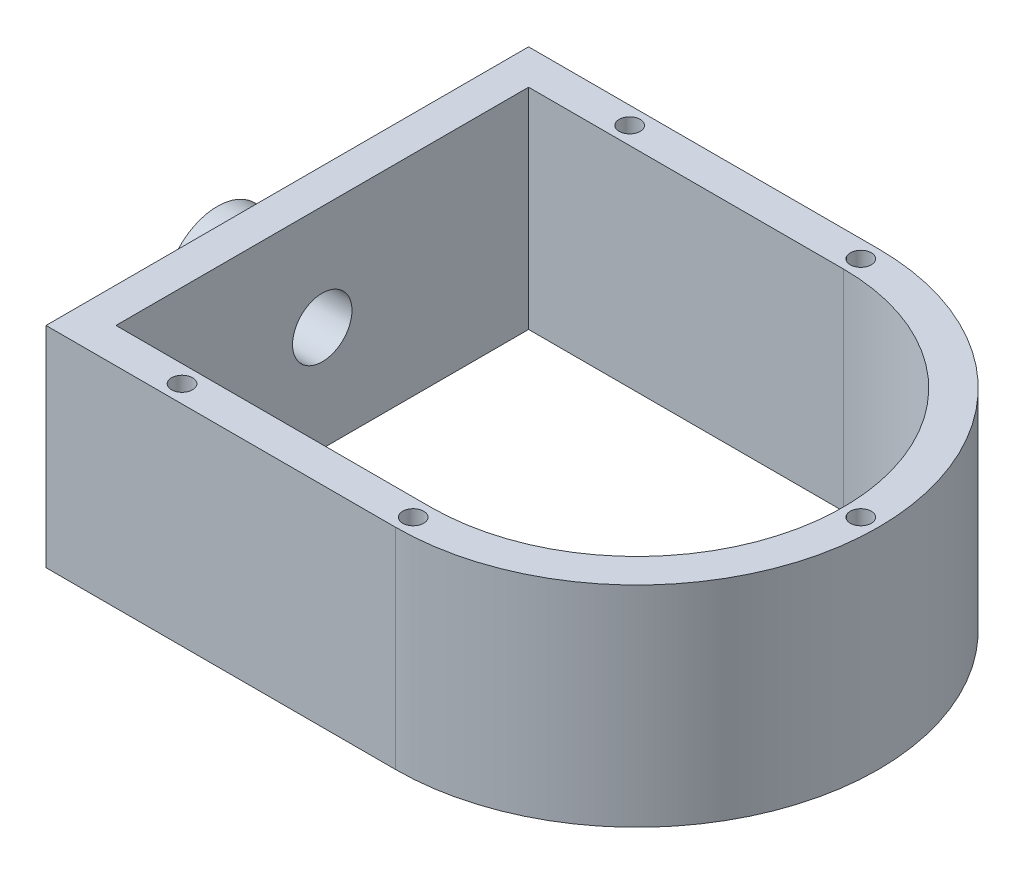
ISO-10303-21;
HEADER;
FILE_DESCRIPTION(('STEP AP214'),'2;1');
FILE_NAME('part.step','',(''),(''),'','','');
FILE_SCHEMA(('AUTOMOTIVE_DESIGN { 1 0 10303 214 1 1 1 1 }'));
ENDSEC;
DATA;
#1=APPLICATION_CONTEXT('core data for automotive mechanical design processes');
#2=APPLICATION_PROTOCOL_DEFINITION('international standard','automotive_design',2000,#1);
#3=PRODUCT_CONTEXT('',#1,'mechanical');
#4=PRODUCT('Part','Part','',(#3));
#5=PRODUCT_RELATED_PRODUCT_CATEGORY('part','',(#4));
#6=PRODUCT_DEFINITION_FORMATION('','',#4);
#7=PRODUCT_DEFINITION_CONTEXT('part definition',#1,'design');
#8=PRODUCT_DEFINITION('design','',#6,#7);
#9=PRODUCT_DEFINITION_SHAPE('','',#8);
#10=(LENGTH_UNIT() NAMED_UNIT(*) SI_UNIT(.MILLI.,.METRE.));
#11=(NAMED_UNIT(*) PLANE_ANGLE_UNIT() SI_UNIT($,.RADIAN.));
#12=(NAMED_UNIT(*) SI_UNIT($,.STERADIAN.) SOLID_ANGLE_UNIT());
#13=UNCERTAINTY_MEASURE_WITH_UNIT(LENGTH_MEASURE(1.E-05),#10,'distance_accuracy_value','');
#14=(GEOMETRIC_REPRESENTATION_CONTEXT(3) GLOBAL_UNCERTAINTY_ASSIGNED_CONTEXT((#13)) GLOBAL_UNIT_ASSIGNED_CONTEXT((#10,
#11,#12)) REPRESENTATION_CONTEXT('',''));
#15=CARTESIAN_POINT('',(0.,0.,0.));
#16=DIRECTION('',(0.,0.,1.));
#17=DIRECTION('',(1.,0.,0.));
#18=AXIS2_PLACEMENT_3D('',#15,#16,#17);
#19=CARTESIAN_POINT('',(-40.,30.,0.));
#20=DIRECTION('',(-1.,0.,0.));
#21=DIRECTION('',(0.,0.,1.));
#22=AXIS2_PLACEMENT_3D('',#19,#20,#21);
#23=PLANE('',#22);
#24=CARTESIAN_POINT('',(-40.,15.,0.));
#25=DIRECTION('',(-1.,0.,0.));
#26=DIRECTION('',(0.,0.,1.));
#27=AXIS2_PLACEMENT_3D('',#24,#25,#26);
#28=CIRCLE('',#27,12.5);
#29=CARTESIAN_POINT('',(-40.,15.,12.5));
#30=VERTEX_POINT('',#29);
#31=EDGE_CURVE('E11',#30,#30,#28,.F.);
#32=ORIENTED_EDGE('',*,*,#31,.T.);
#33=EDGE_LOOP('',(#32));
#34=FACE_BOUND('',#33,.T.);
#35=DIRECTION('',(0.,0.,-1.));
#36=VECTOR('',#35,1.);
#37=CARTESIAN_POINT('',(-40.,0.,0.));
#38=LINE('',#37,#36);
#39=CARTESIAN_POINT('',(-40.,0.,34.5));
#40=VERTEX_POINT('',#39);
#41=CARTESIAN_POINT('',(-40.,0.,-34.5));
#42=VERTEX_POINT('',#41);
#43=EDGE_CURVE('E203',#40,#42,#38,.T.);
#44=ORIENTED_EDGE('',*,*,#43,.F.);
#45=DIRECTION('',(0.,-1.,0.));
#46=VECTOR('',#45,1.);
#47=CARTESIAN_POINT('',(-40.,30.,34.5));
#48=LINE('',#47,#46);
#49=CARTESIAN_POINT('',(-40.,30.,34.5));
#50=VERTEX_POINT('',#49);
#51=EDGE_CURVE('E226',#50,#40,#48,.T.);
#52=ORIENTED_EDGE('',*,*,#51,.F.);
#53=DIRECTION('',(0.,0.,-1.));
#54=VECTOR('',#53,1.);
#55=CARTESIAN_POINT('',(-40.,30.,0.));
#56=LINE('',#55,#54);
#57=CARTESIAN_POINT('',(-40.,30.,-34.5));
#58=VERTEX_POINT('',#57);
#59=EDGE_CURVE('E167',#50,#58,#56,.T.);
#60=ORIENTED_EDGE('',*,*,#59,.T.);
#61=DIRECTION('',(0.,-1.,0.));
#62=VECTOR('',#61,1.);
#63=CARTESIAN_POINT('',(-40.,30.,-34.5));
#64=LINE('',#63,#62);
#65=EDGE_CURVE('E228',#58,#42,#64,.T.);
#66=ORIENTED_EDGE('',*,*,#65,.T.);
#67=EDGE_LOOP('',(#44,#52,#60,#66));
#68=FACE_BOUND('',#67,.T.);
#69=ADVANCED_FACE('F35',(#34,#68),#23,.T.);
#70=CARTESIAN_POINT('',(10.,30.,0.));
#71=DIRECTION('',(0.,-1.,0.));
#72=DIRECTION('',(0.,0.,-1.));
#73=AXIS2_PLACEMENT_3D('',#70,#71,#72);
#74=CYLINDRICAL_SURFACE('',#73,29.5);
#75=DIRECTION('',(0.,-1.,0.));
#76=VECTOR('',#75,1.);
#77=CARTESIAN_POINT('',(30.,3.,21.6852484422014));
#78=LINE('',#77,#76);
#79=CARTESIAN_POINT('',(30.,3.,21.6852484422014));
#80=VERTEX_POINT('',#79);
#81=CARTESIAN_POINT('',(30.,0.,21.6852484422014));
#82=VERTEX_POINT('',#81);
#83=EDGE_CURVE('E127',#80,#82,#78,.T.);
#84=ORIENTED_EDGE('',*,*,#83,.T.);
#85=CARTESIAN_POINT('',(10.,0.,0.));
#86=DIRECTION('',(0.,1.,0.));
#87=DIRECTION('',(0.,0.,1.));
#88=AXIS2_PLACEMENT_3D('',#85,#86,#87);
#89=CIRCLE('',#88,29.5);
#90=CARTESIAN_POINT('',(10.,0.,29.5));
#91=VERTEX_POINT('',#90);
#92=EDGE_CURVE('E113',#82,#91,#89,.F.);
#93=ORIENTED_EDGE('',*,*,#92,.T.);
#94=DIRECTION('',(0.,-1.,0.));
#95=VECTOR('',#94,1.);
#96=CARTESIAN_POINT('',(10.,30.,29.5));
#97=LINE('',#96,#95);
#98=CARTESIAN_POINT('',(10.,30.,29.5));
#99=VERTEX_POINT('',#98);
#100=EDGE_CURVE('E220',#99,#91,#97,.T.);
#101=ORIENTED_EDGE('',*,*,#100,.F.);
#102=CARTESIAN_POINT('',(10.,30.,0.));
#103=DIRECTION('',(0.,1.,0.));
#104=DIRECTION('',(0.,0.,1.));
#105=AXIS2_PLACEMENT_3D('',#102,#103,#104);
#106=CIRCLE('',#105,29.5);
#107=CARTESIAN_POINT('',(10.,30.,-29.5));
#108=VERTEX_POINT('',#107);
#109=EDGE_CURVE('E176',#108,#99,#106,.F.);
#110=ORIENTED_EDGE('',*,*,#109,.F.);
#111=DIRECTION('',(0.,-1.,0.));
#112=VECTOR('',#111,1.);
#113=CARTESIAN_POINT('',(10.,30.,-29.5));
#114=LINE('',#113,#112);
#115=CARTESIAN_POINT('',(10.,0.,-29.5));
#116=VERTEX_POINT('',#115);
#117=EDGE_CURVE('E222',#108,#116,#114,.T.);
#118=ORIENTED_EDGE('',*,*,#117,.T.);
#119=CARTESIAN_POINT('',(30.,0.,-21.6852484422014));
#120=VERTEX_POINT('',#119);
#121=EDGE_CURVE('E123',#116,#120,#89,.F.);
#122=ORIENTED_EDGE('',*,*,#121,.T.);
#123=DIRECTION('',(0.,-1.,0.));
#124=VECTOR('',#123,1.);
#125=CARTESIAN_POINT('',(30.,3.,-21.6852484422014));
#126=LINE('',#125,#124);
#127=CARTESIAN_POINT('',(30.,3.,-21.6852484422014));
#128=VERTEX_POINT('',#127);
#129=EDGE_CURVE('E56',#128,#120,#126,.T.);
#130=ORIENTED_EDGE('',*,*,#129,.F.);
#131=CARTESIAN_POINT('',(10.,3.,0.));
#132=DIRECTION('',(0.,1.,0.));
#133=DIRECTION('',(0.,0.,1.));
#134=AXIS2_PLACEMENT_3D('',#131,#132,#133);
#135=CIRCLE('',#134,29.5);
#136=EDGE_CURVE('E51',#128,#80,#135,.F.);
#137=ORIENTED_EDGE('',*,*,#136,.T.);
#138=EDGE_LOOP('',(#84,#93,#101,#110,#118,#122,#130,#137));
#139=FACE_BOUND('',#138,.T.);
#140=ADVANCED_FACE('F128',(#139),#74,.F.);
#141=CARTESIAN_POINT('',(0.,30.,-29.5));
#142=DIRECTION('',(0.,0.,-1.));
#143=DIRECTION('',(-1.,0.,0.));
#144=AXIS2_PLACEMENT_3D('',#141,#142,#143);
#145=PLANE('',#144);
#146=DIRECTION('',(1.,0.,0.));
#147=VECTOR('',#146,1.);
#148=CARTESIAN_POINT('',(0.,0.,-29.5));
#149=LINE('',#148,#147);
#150=CARTESIAN_POINT('',(-35.,0.,-29.5));
#151=VERTEX_POINT('',#150);
#152=EDGE_CURVE('E124',#151,#116,#149,.T.);
#153=ORIENTED_EDGE('',*,*,#152,.T.);
#154=ORIENTED_EDGE('',*,*,#117,.F.);
#155=DIRECTION('',(1.,0.,0.));
#156=VECTOR('',#155,1.);
#157=CARTESIAN_POINT('',(0.,30.,-29.5));
#158=LINE('',#157,#156);
#159=CARTESIAN_POINT('',(-35.,30.,-29.5));
#160=VERTEX_POINT('',#159);
#161=EDGE_CURVE('E173',#160,#108,#158,.T.);
#162=ORIENTED_EDGE('',*,*,#161,.F.);
#163=DIRECTION('',(0.,-1.,0.));
#164=VECTOR('',#163,1.);
#165=CARTESIAN_POINT('',(-35.,30.,-29.5));
#166=LINE('',#165,#164);
#167=EDGE_CURVE('E213',#160,#151,#166,.T.);
#168=ORIENTED_EDGE('',*,*,#167,.T.);
#169=EDGE_LOOP('',(#153,#154,#162,#168));
#170=FACE_BOUND('',#169,.T.);
#171=ADVANCED_FACE('F253',(#170),#145,.F.);
#172=CARTESIAN_POINT('',(0.,30.,29.5));
#173=DIRECTION('',(0.,0.,1.));
#174=DIRECTION('',(1.,0.,0.));
#175=AXIS2_PLACEMENT_3D('',#172,#173,#174);
#176=PLANE('',#175);
#177=DIRECTION('',(-1.,0.,0.));
#178=VECTOR('',#177,1.);
#179=CARTESIAN_POINT('',(0.,0.,29.5));
#180=LINE('',#179,#178);
#181=CARTESIAN_POINT('',(-35.,0.,29.5));
#182=VERTEX_POINT('',#181);
#183=EDGE_CURVE('E120',#91,#182,#180,.T.);
#184=ORIENTED_EDGE('',*,*,#183,.T.);
#185=DIRECTION('',(0.,-1.,0.));
#186=VECTOR('',#185,1.);
#187=CARTESIAN_POINT('',(-35.,30.,29.5));
#188=LINE('',#187,#186);
#189=CARTESIAN_POINT('',(-35.,30.,29.5));
#190=VERTEX_POINT('',#189);
#191=EDGE_CURVE('E216',#190,#182,#188,.T.);
#192=ORIENTED_EDGE('',*,*,#191,.F.);
#193=DIRECTION('',(-1.,0.,0.));
#194=VECTOR('',#193,1.);
#195=CARTESIAN_POINT('',(0.,30.,29.5));
#196=LINE('',#195,#194);
#197=EDGE_CURVE('E178',#99,#190,#196,.T.);
#198=ORIENTED_EDGE('',*,*,#197,.F.);
#199=ORIENTED_EDGE('',*,*,#100,.T.);
#200=EDGE_LOOP('',(#184,#192,#198,#199));
#201=FACE_BOUND('',#200,.T.);
#202=ADVANCED_FACE('F267',(#201),#176,.F.);
#203=CARTESIAN_POINT('',(10.,30.,0.));
#204=DIRECTION('',(0.,-1.,0.));
#205=DIRECTION('',(0.,0.,-1.));
#206=AXIS2_PLACEMENT_3D('',#203,#204,#205);
#207=CYLINDRICAL_SURFACE('',#206,34.5);
#208=CARTESIAN_POINT('',(10.,0.,0.));
#209=DIRECTION('',(0.,1.,0.));
#210=DIRECTION('',(0.,0.,1.));
#211=AXIS2_PLACEMENT_3D('',#208,#209,#210);
#212=CIRCLE('',#211,34.5);
#213=CARTESIAN_POINT('',(10.,0.,-34.5));
#214=VERTEX_POINT('',#213);
#215=CARTESIAN_POINT('',(9.99999999999999,0.,34.5));
#216=VERTEX_POINT('',#215);
#217=EDGE_CURVE('E197',#214,#216,#212,.F.);
#218=ORIENTED_EDGE('',*,*,#217,.F.);
#219=DIRECTION('',(0.,-1.,0.));
#220=VECTOR('',#219,1.);
#221=CARTESIAN_POINT('',(10.,30.,-34.5));
#222=LINE('',#221,#220);
#223=CARTESIAN_POINT('',(10.,30.,-34.5));
#224=VERTEX_POINT('',#223);
#225=EDGE_CURVE('E217',#224,#214,#222,.T.);
#226=ORIENTED_EDGE('',*,*,#225,.F.);
#227=CARTESIAN_POINT('',(10.,30.,0.));
#228=DIRECTION('',(0.,1.,0.));
#229=DIRECTION('',(0.,0.,1.));
#230=AXIS2_PLACEMENT_3D('',#227,#228,#229);
#231=CIRCLE('',#230,34.5);
#232=CARTESIAN_POINT('',(9.99999999999999,30.,34.5));
#233=VERTEX_POINT('',#232);
#234=EDGE_CURVE('E161',#224,#233,#231,.F.);
#235=ORIENTED_EDGE('',*,*,#234,.T.);
#236=DIRECTION('',(0.,-1.,0.));
#237=VECTOR('',#236,1.);
#238=CARTESIAN_POINT('',(9.99999999999999,30.,34.5));
#239=LINE('',#238,#237);
#240=EDGE_CURVE('E182',#233,#216,#239,.T.);
#241=ORIENTED_EDGE('',*,*,#240,.T.);
#242=EDGE_LOOP('',(#218,#226,#235,#241));
#243=FACE_BOUND('',#242,.T.);
#244=ADVANCED_FACE('F263',(#243),#207,.T.);
#245=CARTESIAN_POINT('',(0.,30.,-34.5));
#246=DIRECTION('',(0.,0.,-1.));
#247=DIRECTION('',(-1.,0.,0.));
#248=AXIS2_PLACEMENT_3D('',#245,#246,#247);
#249=PLANE('',#248);
#250=DIRECTION('',(1.,0.,0.));
#251=VECTOR('',#250,1.);
#252=CARTESIAN_POINT('',(0.,0.,-34.5));
#253=LINE('',#252,#251);
#254=EDGE_CURVE('E200',#42,#214,#253,.T.);
#255=ORIENTED_EDGE('',*,*,#254,.F.);
#256=ORIENTED_EDGE('',*,*,#65,.F.);
#257=DIRECTION('',(1.,0.,0.));
#258=VECTOR('',#257,1.);
#259=CARTESIAN_POINT('',(0.,30.,-34.5));
#260=LINE('',#259,#258);
#261=EDGE_CURVE('E164',#58,#224,#260,.T.);
#262=ORIENTED_EDGE('',*,*,#261,.T.);
#263=ORIENTED_EDGE('',*,*,#225,.T.);
#264=EDGE_LOOP('',(#255,#256,#262,#263));
#265=FACE_BOUND('',#264,.T.);
#266=ADVANCED_FACE('F260',(#265),#249,.T.);
#267=CARTESIAN_POINT('',(0.,30.,34.5));
#268=DIRECTION('',(0.,0.,1.));
#269=DIRECTION('',(1.,0.,0.));
#270=AXIS2_PLACEMENT_3D('',#267,#268,#269);
#271=PLANE('',#270);
#272=DIRECTION('',(-1.,0.,0.));
#273=VECTOR('',#272,1.);
#274=CARTESIAN_POINT('',(0.,0.,34.5));
#275=LINE('',#274,#273);
#276=EDGE_CURVE('E206',#216,#40,#275,.T.);
#277=ORIENTED_EDGE('',*,*,#276,.F.);
#278=ORIENTED_EDGE('',*,*,#240,.F.);
#279=DIRECTION('',(-1.,0.,0.));
#280=VECTOR('',#279,1.);
#281=CARTESIAN_POINT('',(0.,30.,34.5));
#282=LINE('',#281,#280);
#283=EDGE_CURVE('E170',#233,#50,#282,.T.);
#284=ORIENTED_EDGE('',*,*,#283,.T.);
#285=ORIENTED_EDGE('',*,*,#51,.T.);
#286=EDGE_LOOP('',(#277,#278,#284,#285));
#287=FACE_BOUND('',#286,.T.);
#288=ADVANCED_FACE('F258',(#287),#271,.T.);
#289=CARTESIAN_POINT('',(-23.050007367458,30.,-32.));
#290=DIRECTION('',(0.,-1.,0.));
#291=DIRECTION('',(0.,0.,-1.));
#292=AXIS2_PLACEMENT_3D('',#289,#290,#291);
#293=CYLINDRICAL_SURFACE('',#292,1.5);
#294=CARTESIAN_POINT('',(-23.050007367458,30.,-32.));
#295=DIRECTION('',(0.,1.,0.));
#296=DIRECTION('',(0.,0.,1.));
#297=AXIS2_PLACEMENT_3D('',#294,#295,#296);
#298=CIRCLE('',#297,1.5);
#299=CARTESIAN_POINT('',(-23.050007367458,30.,-30.5));
#300=VERTEX_POINT('',#299);
#301=EDGE_CURVE('E158',#300,#300,#298,.T.);
#302=ORIENTED_EDGE('',*,*,#301,.T.);
#303=EDGE_LOOP('',(#302));
#304=FACE_BOUND('',#303,.T.);
#305=CARTESIAN_POINT('',(-23.050007367458,0.,-32.));
#306=DIRECTION('',(0.,1.,0.));
#307=DIRECTION('',(0.,0.,1.));
#308=AXIS2_PLACEMENT_3D('',#305,#306,#307);
#309=CIRCLE('',#308,1.5);
#310=CARTESIAN_POINT('',(-23.050007367458,0.,-30.5));
#311=VERTEX_POINT('',#310);
#312=EDGE_CURVE('E194',#311,#311,#309,.T.);
#313=ORIENTED_EDGE('',*,*,#312,.F.);
#314=EDGE_LOOP('',(#313));
#315=FACE_BOUND('',#314,.T.);
#316=ADVANCED_FACE('F269',(#304,#315),#293,.F.);
#317=CARTESIAN_POINT('',(-23.050007367458,30.,32.));
#318=DIRECTION('',(0.,-1.,0.));
#319=DIRECTION('',(0.,0.,-1.));
#320=AXIS2_PLACEMENT_3D('',#317,#318,#319);
#321=CYLINDRICAL_SURFACE('',#320,1.5);
#322=CARTESIAN_POINT('',(-23.050007367458,30.,32.));
#323=DIRECTION('',(0.,1.,0.));
#324=DIRECTION('',(0.,0.,1.));
#325=AXIS2_PLACEMENT_3D('',#322,#323,#324);
#326=CIRCLE('',#325,1.5);
#327=CARTESIAN_POINT('',(-23.050007367458,30.,33.5));
#328=VERTEX_POINT('',#327);
#329=EDGE_CURVE('E155',#328,#328,#326,.T.);
#330=ORIENTED_EDGE('',*,*,#329,.T.);
#331=EDGE_LOOP('',(#330));
#332=FACE_BOUND('',#331,.T.);
#333=CARTESIAN_POINT('',(-23.050007367458,0.,32.));
#334=DIRECTION('',(0.,1.,0.));
#335=DIRECTION('',(0.,0.,1.));
#336=AXIS2_PLACEMENT_3D('',#333,#334,#335);
#337=CIRCLE('',#336,1.5);
#338=CARTESIAN_POINT('',(-23.050007367458,0.,33.5));
#339=VERTEX_POINT('',#338);
#340=EDGE_CURVE('E191',#339,#339,#337,.T.);
#341=ORIENTED_EDGE('',*,*,#340,.F.);
#342=EDGE_LOOP('',(#341));
#343=FACE_BOUND('',#342,.T.);
#344=ADVANCED_FACE('F272',(#332,#343),#321,.F.);
#345=CARTESIAN_POINT('',(10.,30.,-32.));
#346=DIRECTION('',(0.,-1.,0.));
#347=DIRECTION('',(0.,0.,-1.));
#348=AXIS2_PLACEMENT_3D('',#345,#346,#347);
#349=CYLINDRICAL_SURFACE('',#348,1.5);
#350=CARTESIAN_POINT('',(10.,30.,-32.));
#351=DIRECTION('',(0.,1.,0.));
#352=DIRECTION('',(0.,0.,1.));
#353=AXIS2_PLACEMENT_3D('',#350,#351,#352);
#354=CIRCLE('',#353,1.5);
#355=CARTESIAN_POINT('',(10.,30.,-30.5));
#356=VERTEX_POINT('',#355);
#357=EDGE_CURVE('E152',#356,#356,#354,.T.);
#358=ORIENTED_EDGE('',*,*,#357,.T.);
#359=EDGE_LOOP('',(#358));
#360=FACE_BOUND('',#359,.T.);
#361=CARTESIAN_POINT('',(10.,0.,-32.));
#362=DIRECTION('',(0.,1.,0.));
#363=DIRECTION('',(0.,0.,1.));
#364=AXIS2_PLACEMENT_3D('',#361,#362,#363);
#365=CIRCLE('',#364,1.5);
#366=CARTESIAN_POINT('',(10.,0.,-30.5));
#367=VERTEX_POINT('',#366);
#368=EDGE_CURVE('E188',#367,#367,#365,.T.);
#369=ORIENTED_EDGE('',*,*,#368,.F.);
#370=EDGE_LOOP('',(#369));
#371=FACE_BOUND('',#370,.T.);
#372=ADVANCED_FACE('F276',(#360,#371),#349,.F.);
#373=CARTESIAN_POINT('',(10.,30.,32.));
#374=DIRECTION('',(0.,-1.,0.));
#375=DIRECTION('',(0.,0.,-1.));
#376=AXIS2_PLACEMENT_3D('',#373,#374,#375);
#377=CYLINDRICAL_SURFACE('',#376,1.5);
#378=CARTESIAN_POINT('',(10.,30.,32.));
#379=DIRECTION('',(0.,1.,0.));
#380=DIRECTION('',(0.,0.,1.));
#381=AXIS2_PLACEMENT_3D('',#378,#379,#380);
#382=CIRCLE('',#381,1.5);
#383=CARTESIAN_POINT('',(10.,30.,33.5));
#384=VERTEX_POINT('',#383);
#385=EDGE_CURVE('E148',#384,#384,#382,.T.);
#386=ORIENTED_EDGE('',*,*,#385,.T.);
#387=EDGE_LOOP('',(#386));
#388=FACE_BOUND('',#387,.T.);
#389=CARTESIAN_POINT('',(10.,0.,32.));
#390=DIRECTION('',(0.,1.,0.));
#391=DIRECTION('',(0.,0.,1.));
#392=AXIS2_PLACEMENT_3D('',#389,#390,#391);
#393=CIRCLE('',#392,1.5);
#394=CARTESIAN_POINT('',(10.,0.,33.5));
#395=VERTEX_POINT('',#394);
#396=EDGE_CURVE('E185',#395,#395,#393,.T.);
#397=ORIENTED_EDGE('',*,*,#396,.F.);
#398=EDGE_LOOP('',(#397));
#399=FACE_BOUND('',#398,.T.);
#400=ADVANCED_FACE('F280',(#388,#399),#377,.F.);
#401=CARTESIAN_POINT('',(42.,30.,0.));
#402=DIRECTION('',(0.,-1.,0.));
#403=DIRECTION('',(0.,0.,-1.));
#404=AXIS2_PLACEMENT_3D('',#401,#402,#403);
#405=CYLINDRICAL_SURFACE('',#404,1.5);
#406=CARTESIAN_POINT('',(42.,30.,0.));
#407=DIRECTION('',(0.,1.,0.));
#408=DIRECTION('',(0.,0.,1.));
#409=AXIS2_PLACEMENT_3D('',#406,#407,#408);
#410=CIRCLE('',#409,1.5);
#411=CARTESIAN_POINT('',(42.,30.,1.5));
#412=VERTEX_POINT('',#411);
#413=EDGE_CURVE('E145',#412,#412,#410,.T.);
#414=ORIENTED_EDGE('',*,*,#413,.T.);
#415=EDGE_LOOP('',(#414));
#416=FACE_BOUND('',#415,.T.);
#417=CARTESIAN_POINT('',(42.,0.,0.));
#418=DIRECTION('',(0.,1.,0.));
#419=DIRECTION('',(0.,0.,1.));
#420=AXIS2_PLACEMENT_3D('',#417,#418,#419);
#421=CIRCLE('',#420,1.5);
#422=CARTESIAN_POINT('',(42.,0.,1.5));
#423=VERTEX_POINT('',#422);
#424=EDGE_CURVE('E144',#423,#423,#421,.T.);
#425=ORIENTED_EDGE('',*,*,#424,.F.);
#426=EDGE_LOOP('',(#425));
#427=FACE_BOUND('',#426,.T.);
#428=ADVANCED_FACE('F283',(#416,#427),#405,.F.);
#429=CARTESIAN_POINT('',(-35.,30.,0.));
#430=DIRECTION('',(-1.,0.,0.));
#431=DIRECTION('',(0.,0.,1.));
#432=AXIS2_PLACEMENT_3D('',#429,#430,#431);
#433=PLANE('',#432);
#434=CARTESIAN_POINT('',(-35.,15.,0.));
#435=DIRECTION('',(-1.,0.,0.));
#436=DIRECTION('',(0.,0.,1.));
#437=AXIS2_PLACEMENT_3D('',#434,#435,#436);
#438=CIRCLE('',#437,4.25);
#439=CARTESIAN_POINT('',(-35.,15.,4.25000000000001));
#440=VERTEX_POINT('',#439);
#441=EDGE_CURVE('E39',#440,#440,#438,.T.);
#442=ORIENTED_EDGE('',*,*,#441,.T.);
#443=EDGE_LOOP('',(#442));
#444=FACE_BOUND('',#443,.T.);
#445=DIRECTION('',(0.,0.,-1.));
#446=VECTOR('',#445,1.);
#447=CARTESIAN_POINT('',(-35.,0.,0.));
#448=LINE('',#447,#446);
#449=EDGE_CURVE('E149',#182,#151,#448,.T.);
#450=ORIENTED_EDGE('',*,*,#449,.T.);
#451=ORIENTED_EDGE('',*,*,#167,.F.);
#452=DIRECTION('',(0.,0.,-1.));
#453=VECTOR('',#452,1.);
#454=CARTESIAN_POINT('',(-35.,30.,0.));
#455=LINE('',#454,#453);
#456=EDGE_CURVE('E180',#190,#160,#455,.T.);
#457=ORIENTED_EDGE('',*,*,#456,.F.);
#458=ORIENTED_EDGE('',*,*,#191,.T.);
#459=EDGE_LOOP('',(#450,#451,#457,#458));
#460=FACE_BOUND('',#459,.T.);
#461=ADVANCED_FACE('F286',(#444,#460),#433,.F.);
#462=CARTESIAN_POINT('',(0.,30.,0.));
#463=DIRECTION('',(0.,1.,0.));
#464=DIRECTION('',(0.,0.,1.));
#465=AXIS2_PLACEMENT_3D('',#462,#463,#464);
#466=PLANE('',#465);
#467=ORIENTED_EDGE('',*,*,#413,.F.);
#468=EDGE_LOOP('',(#467));
#469=FACE_BOUND('',#468,.T.);
#470=ORIENTED_EDGE('',*,*,#385,.F.);
#471=EDGE_LOOP('',(#470));
#472=FACE_BOUND('',#471,.T.);
#473=ORIENTED_EDGE('',*,*,#357,.F.);
#474=EDGE_LOOP('',(#473));
#475=FACE_BOUND('',#474,.T.);
#476=ORIENTED_EDGE('',*,*,#329,.F.);
#477=EDGE_LOOP('',(#476));
#478=FACE_BOUND('',#477,.T.);
#479=ORIENTED_EDGE('',*,*,#301,.F.);
#480=EDGE_LOOP('',(#479));
#481=FACE_BOUND('',#480,.T.);
#482=ORIENTED_EDGE('',*,*,#234,.F.);
#483=ORIENTED_EDGE('',*,*,#261,.F.);
#484=ORIENTED_EDGE('',*,*,#59,.F.);
#485=ORIENTED_EDGE('',*,*,#283,.F.);
#486=EDGE_LOOP('',(#482,#483,#484,#485));
#487=FACE_BOUND('',#486,.T.);
#488=ORIENTED_EDGE('',*,*,#161,.T.);
#489=ORIENTED_EDGE('',*,*,#109,.T.);
#490=ORIENTED_EDGE('',*,*,#197,.T.);
#491=ORIENTED_EDGE('',*,*,#456,.T.);
#492=EDGE_LOOP('',(#488,#489,#490,#491));
#493=FACE_BOUND('',#492,.T.);
#494=ADVANCED_FACE('F292',(#469,#472,#475,#478,#481,#487,#493),#466,.T.);
#495=CARTESIAN_POINT('',(0.,0.,0.));
#496=DIRECTION('',(0.,1.,0.));
#497=DIRECTION('',(0.,0.,1.));
#498=AXIS2_PLACEMENT_3D('',#495,#496,#497);
#499=PLANE('',#498);
#500=ORIENTED_EDGE('',*,*,#424,.T.);
#501=EDGE_LOOP('',(#500));
#502=FACE_BOUND('',#501,.T.);
#503=ORIENTED_EDGE('',*,*,#396,.T.);
#504=EDGE_LOOP('',(#503));
#505=FACE_BOUND('',#504,.T.);
#506=ORIENTED_EDGE('',*,*,#368,.T.);
#507=EDGE_LOOP('',(#506));
#508=FACE_BOUND('',#507,.T.);
#509=ORIENTED_EDGE('',*,*,#340,.T.);
#510=EDGE_LOOP('',(#509));
#511=FACE_BOUND('',#510,.T.);
#512=ORIENTED_EDGE('',*,*,#312,.T.);
#513=EDGE_LOOP('',(#512));
#514=FACE_BOUND('',#513,.T.);
#515=ORIENTED_EDGE('',*,*,#217,.T.);
#516=ORIENTED_EDGE('',*,*,#276,.T.);
#517=ORIENTED_EDGE('',*,*,#43,.T.);
#518=ORIENTED_EDGE('',*,*,#254,.T.);
#519=EDGE_LOOP('',(#515,#516,#517,#518));
#520=FACE_BOUND('',#519,.T.);
#521=ORIENTED_EDGE('',*,*,#152,.F.);
#522=ORIENTED_EDGE('',*,*,#449,.F.);
#523=ORIENTED_EDGE('',*,*,#183,.F.);
#524=ORIENTED_EDGE('',*,*,#92,.F.);
#525=DIRECTION('',(0.,0.,1.));
#526=VECTOR('',#525,1.);
#527=CARTESIAN_POINT('',(30.,0.,0.));
#528=LINE('',#527,#526);
#529=EDGE_CURVE('E118',#120,#82,#528,.T.);
#530=ORIENTED_EDGE('',*,*,#529,.F.);
#531=ORIENTED_EDGE('',*,*,#121,.F.);
#532=EDGE_LOOP('',(#521,#522,#523,#524,#530,#531));
#533=FACE_BOUND('',#532,.T.);
#534=CARTESIAN_POINT('',(35.,0.,0.));
#535=DIRECTION('',(0.,1.,0.));
#536=DIRECTION('',(0.,0.,1.));
#537=AXIS2_PLACEMENT_3D('',#534,#535,#536);
#538=CIRCLE('',#537,2.5);
#539=CARTESIAN_POINT('',(35.,0.,2.5));
#540=VERTEX_POINT('',#539);
#541=EDGE_CURVE('E134',#540,#540,#538,.T.);
#542=ORIENTED_EDGE('',*,*,#541,.T.);
#543=EDGE_LOOP('',(#542));
#544=FACE_BOUND('',#543,.T.);
#545=ADVANCED_FACE('F115',(#502,#505,#508,#511,#514,#520,#533,#544),#499,.F.);
#546=CARTESIAN_POINT('',(35.,3.,0.));
#547=DIRECTION('',(0.,-1.,0.));
#548=DIRECTION('',(0.,0.,-1.));
#549=AXIS2_PLACEMENT_3D('',#546,#547,#548);
#550=CYLINDRICAL_SURFACE('',#549,2.5);
#551=CARTESIAN_POINT('',(35.,3.,0.));
#552=DIRECTION('',(0.,1.,0.));
#553=DIRECTION('',(0.,0.,1.));
#554=AXIS2_PLACEMENT_3D('',#551,#552,#553);
#555=CIRCLE('',#554,2.5);
#556=CARTESIAN_POINT('',(35.,3.,2.5));
#557=VERTEX_POINT('',#556);
#558=EDGE_CURVE('E133',#557,#557,#555,.T.);
#559=ORIENTED_EDGE('',*,*,#558,.T.);
#560=EDGE_LOOP('',(#559));
#561=FACE_BOUND('',#560,.T.);
#562=ORIENTED_EDGE('',*,*,#541,.F.);
#563=EDGE_LOOP('',(#562));
#564=FACE_BOUND('',#563,.T.);
#565=ADVANCED_FACE('F301',(#561,#564),#550,.F.);
#566=CARTESIAN_POINT('',(30.,3.,0.));
#567=DIRECTION('',(1.,0.,0.));
#568=DIRECTION('',(0.,0.,-1.));
#569=AXIS2_PLACEMENT_3D('',#566,#567,#568);
#570=PLANE('',#569);
#571=ORIENTED_EDGE('',*,*,#529,.T.);
#572=ORIENTED_EDGE('',*,*,#83,.F.);
#573=DIRECTION('',(0.,0.,1.));
#574=VECTOR('',#573,1.);
#575=CARTESIAN_POINT('',(30.,3.,0.));
#576=LINE('',#575,#574);
#577=EDGE_CURVE('E130',#128,#80,#576,.T.);
#578=ORIENTED_EDGE('',*,*,#577,.F.);
#579=ORIENTED_EDGE('',*,*,#129,.T.);
#580=EDGE_LOOP('',(#571,#572,#578,#579));
#581=FACE_BOUND('',#580,.T.);
#582=ADVANCED_FACE('F132',(#581),#570,.F.);
#583=CARTESIAN_POINT('',(0.,3.,0.));
#584=DIRECTION('',(0.,1.,0.));
#585=DIRECTION('',(0.,0.,1.));
#586=AXIS2_PLACEMENT_3D('',#583,#584,#585);
#587=PLANE('',#586);
#588=ORIENTED_EDGE('',*,*,#558,.F.);
#589=EDGE_LOOP('',(#588));
#590=FACE_BOUND('',#589,.T.);
#591=ORIENTED_EDGE('',*,*,#136,.F.);
#592=ORIENTED_EDGE('',*,*,#577,.T.);
#593=EDGE_LOOP('',(#591,#592));
#594=FACE_BOUND('',#593,.T.);
#595=ADVANCED_FACE('F345',(#590,#594),#587,.T.);
#596=CARTESIAN_POINT('',(-50.,15.,0.));
#597=DIRECTION('',(-1.,0.,0.));
#598=DIRECTION('',(0.,0.,1.));
#599=AXIS2_PLACEMENT_3D('',#596,#597,#598);
#600=PLANE('',#599);
#601=CARTESIAN_POINT('',(-50.,15.,0.));
#602=DIRECTION('',(-1.,0.,0.));
#603=DIRECTION('',(0.,0.,1.));
#604=AXIS2_PLACEMENT_3D('',#601,#602,#603);
#605=CIRCLE('',#604,7.5);
#606=CARTESIAN_POINT('',(-50.,15.,7.50000000000001));
#607=VERTEX_POINT('',#606);
#608=EDGE_CURVE('E139',#607,#607,#605,.T.);
#609=ORIENTED_EDGE('',*,*,#608,.T.);
#610=EDGE_LOOP('',(#609));
#611=FACE_BOUND('',#610,.T.);
#612=CARTESIAN_POINT('',(-50.,15.,0.));
#613=DIRECTION('',(-1.,0.,0.));
#614=DIRECTION('',(0.,0.,1.));
#615=AXIS2_PLACEMENT_3D('',#612,#613,#614);
#616=CIRCLE('',#615,4.25);
#617=CARTESIAN_POINT('',(-50.,15.,4.25000000000001));
#618=VERTEX_POINT('',#617);
#619=EDGE_CURVE('E360',#618,#618,#616,.T.);
#620=ORIENTED_EDGE('',*,*,#619,.F.);
#621=EDGE_LOOP('',(#620));
#622=FACE_BOUND('',#621,.T.);
#623=ADVANCED_FACE('F347',(#611,#622),#600,.T.);
#624=CARTESIAN_POINT('',(-50.,15.,0.));
#625=DIRECTION('',(1.,0.,0.));
#626=DIRECTION('',(0.,0.,-1.));
#627=AXIS2_PLACEMENT_3D('',#624,#625,#626);
#628=CYLINDRICAL_SURFACE('',#627,7.5);
#629=CARTESIAN_POINT('',(-45.,15.,0.));
#630=DIRECTION('',(-1.,0.,0.));
#631=DIRECTION('',(0.,0.,1.));
#632=AXIS2_PLACEMENT_3D('',#629,#630,#631);
#633=CIRCLE('',#632,7.5);
#634=CARTESIAN_POINT('',(-45.,15.,7.50000000000001));
#635=VERTEX_POINT('',#634);
#636=EDGE_CURVE('E44',#635,#635,#633,.T.);
#637=ORIENTED_EDGE('',*,*,#636,.T.);
#638=EDGE_LOOP('',(#637));
#639=FACE_BOUND('',#638,.T.);
#640=ORIENTED_EDGE('',*,*,#608,.F.);
#641=EDGE_LOOP('',(#640));
#642=FACE_BOUND('',#641,.T.);
#643=ADVANCED_FACE('F234',(#639,#642),#628,.T.);
#644=CARTESIAN_POINT('',(-37.,15.,0.));
#645=DIRECTION('',(-1.,0.,0.));
#646=DIRECTION('',(0.,0.,1.));
#647=AXIS2_PLACEMENT_3D('',#644,#645,#646);
#648=CYLINDRICAL_SURFACE('',#647,4.25);
#649=ORIENTED_EDGE('',*,*,#619,.T.);
#650=EDGE_LOOP('',(#649));
#651=FACE_BOUND('',#650,.T.);
#652=ORIENTED_EDGE('',*,*,#441,.F.);
#653=EDGE_LOOP('',(#652));
#654=FACE_BOUND('',#653,.T.);
#655=ADVANCED_FACE('F238',(#651,#654),#648,.F.);
#656=CARTESIAN_POINT('',(-45.,15.,0.));
#657=DIRECTION('',(-1.,0.,0.));
#658=DIRECTION('',(0.,0.,1.));
#659=AXIS2_PLACEMENT_3D('',#656,#657,#658);
#660=TOROIDAL_SURFACE('',#659,12.5,5.);
#661=ORIENTED_EDGE('',*,*,#31,.F.);
#662=EDGE_LOOP('',(#661));
#663=FACE_BOUND('',#662,.T.);
#664=ORIENTED_EDGE('',*,*,#636,.F.);
#665=EDGE_LOOP('',(#664));
#666=FACE_BOUND('',#665,.T.);
#667=ADVANCED_FACE('F37',(#663,#666),#660,.F.);
#668=CLOSED_SHELL('',(#69,#140,#171,#202,#244,#266,#288,#316,#344,#372,#400,#428,#461,#494,#545,
#565,#582,#595,#623,#643,#655,#667));
#669=MANIFOLD_SOLID_BREP('B2',#668);
#670=ADVANCED_BREP_SHAPE_REPRESENTATION('',(#18,#669),#14);
#671=SHAPE_DEFINITION_REPRESENTATION(#9,#670);
ENDSEC;
END-ISO-10303-21;
